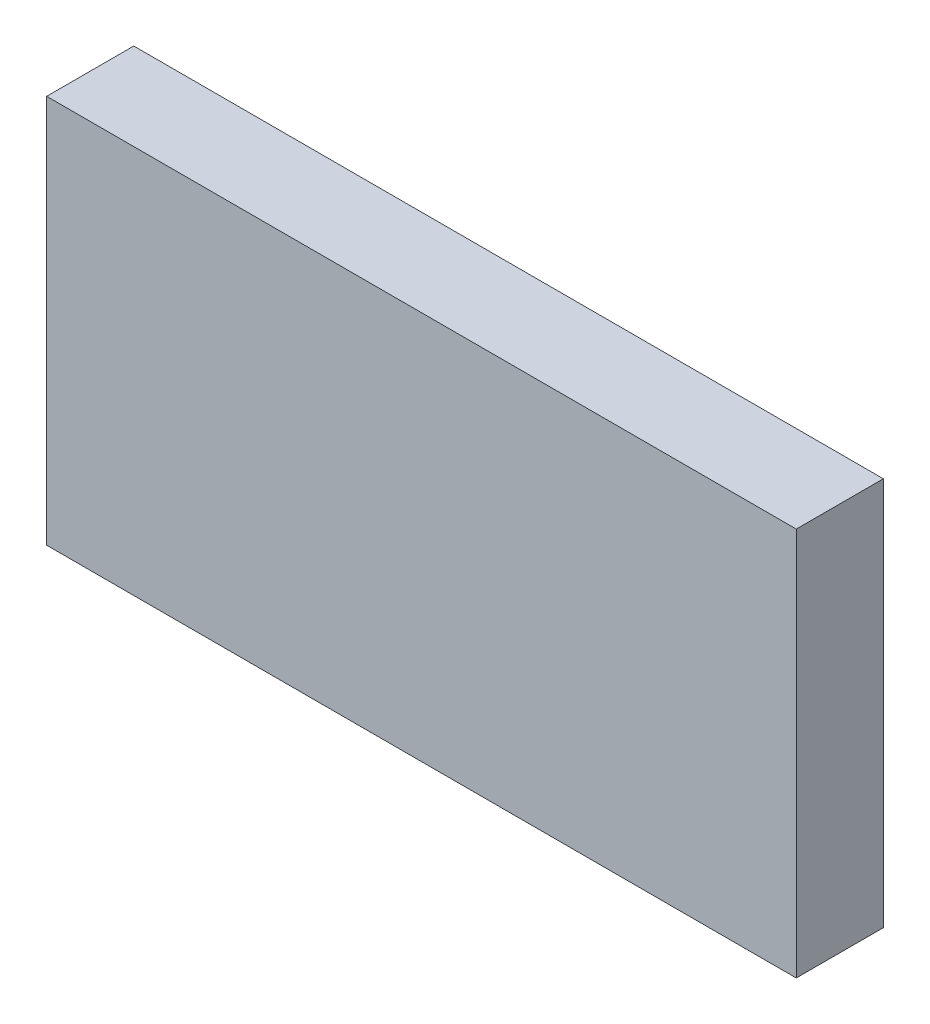
ISO-10303-21;
HEADER;
FILE_DESCRIPTION(('STEP AP214'),'2;1');
FILE_NAME('part.step','',(''),(''),'','','');
FILE_SCHEMA(('AUTOMOTIVE_DESIGN { 1 0 10303 214 1 1 1 1 }'));
ENDSEC;
DATA;
#1=APPLICATION_CONTEXT('core data for automotive mechanical design processes');
#2=APPLICATION_PROTOCOL_DEFINITION('international standard','automotive_design',2000,#1);
#3=PRODUCT_CONTEXT('',#1,'mechanical');
#4=PRODUCT('Part','Part','',(#3));
#5=PRODUCT_RELATED_PRODUCT_CATEGORY('part','',(#4));
#6=PRODUCT_DEFINITION_FORMATION('','',#4);
#7=PRODUCT_DEFINITION_CONTEXT('part definition',#1,'design');
#8=PRODUCT_DEFINITION('design','',#6,#7);
#9=PRODUCT_DEFINITION_SHAPE('','',#8);
#10=(LENGTH_UNIT() NAMED_UNIT(*) SI_UNIT(.MILLI.,.METRE.));
#11=(NAMED_UNIT(*) PLANE_ANGLE_UNIT() SI_UNIT($,.RADIAN.));
#12=(NAMED_UNIT(*) SI_UNIT($,.STERADIAN.) SOLID_ANGLE_UNIT());
#13=UNCERTAINTY_MEASURE_WITH_UNIT(LENGTH_MEASURE(1.E-05),#10,'distance_accuracy_value','');
#14=(GEOMETRIC_REPRESENTATION_CONTEXT(3) GLOBAL_UNCERTAINTY_ASSIGNED_CONTEXT((#13)) GLOBAL_UNIT_ASSIGNED_CONTEXT((#10,
#11,#12)) REPRESENTATION_CONTEXT('',''));
#15=CARTESIAN_POINT('',(0.,0.,0.));
#16=DIRECTION('',(0.,0.,1.));
#17=DIRECTION('',(1.,0.,0.));
#18=AXIS2_PLACEMENT_3D('',#15,#16,#17);
#19=CARTESIAN_POINT('',(0.,12.5,0.));
#20=DIRECTION('',(1.,0.,0.));
#21=DIRECTION('',(0.,0.,-1.));
#22=AXIS2_PLACEMENT_3D('',#19,#20,#21);
#23=PLANE('',#22);
#24=DIRECTION('',(0.,0.,1.));
#25=VECTOR('',#24,1.);
#26=CARTESIAN_POINT('',(0.,0.,0.));
#27=LINE('',#26,#25);
#28=CARTESIAN_POINT('',(0.,0.,-2.8));
#29=VERTEX_POINT('',#28);
#30=CARTESIAN_POINT('',(0.,0.,0.));
#31=VERTEX_POINT('',#30);
#32=EDGE_CURVE('E96',#29,#31,#27,.T.);
#33=ORIENTED_EDGE('',*,*,#32,.T.);
#34=DIRECTION('',(0.,-1.,0.));
#35=VECTOR('',#34,1.);
#36=CARTESIAN_POINT('',(0.,12.5,0.));
#37=LINE('',#36,#35);
#38=CARTESIAN_POINT('',(0.,12.5,0.));
#39=VERTEX_POINT('',#38);
#40=EDGE_CURVE('E11',#39,#31,#37,.T.);
#41=ORIENTED_EDGE('',*,*,#40,.F.);
#42=DIRECTION('',(0.,0.,1.));
#43=VECTOR('',#42,1.);
#44=CARTESIAN_POINT('',(0.,12.5,0.));
#45=LINE('',#44,#43);
#46=CARTESIAN_POINT('',(0.,12.5,-2.8));
#47=VERTEX_POINT('',#46);
#48=EDGE_CURVE('E84',#47,#39,#45,.T.);
#49=ORIENTED_EDGE('',*,*,#48,.F.);
#50=DIRECTION('',(0.,-1.,0.));
#51=VECTOR('',#50,1.);
#52=CARTESIAN_POINT('',(0.,12.5,-2.8));
#53=LINE('',#52,#51);
#54=EDGE_CURVE('E92',#47,#29,#53,.T.);
#55=ORIENTED_EDGE('',*,*,#54,.T.);
#56=EDGE_LOOP('',(#33,#41,#49,#55));
#57=FACE_BOUND('',#56,.T.);
#58=ADVANCED_FACE('F33',(#57),#23,.F.);
#59=CARTESIAN_POINT('',(0.,12.5,0.));
#60=DIRECTION('',(0.,0.,-1.));
#61=DIRECTION('',(-1.,0.,0.));
#62=AXIS2_PLACEMENT_3D('',#59,#60,#61);
#63=PLANE('',#62);
#64=DIRECTION('',(1.,0.,0.));
#65=VECTOR('',#64,1.);
#66=CARTESIAN_POINT('',(0.,0.,0.));
#67=LINE('',#66,#65);
#68=CARTESIAN_POINT('',(24.1,0.,0.));
#69=VERTEX_POINT('',#68);
#70=EDGE_CURVE('E88',#31,#69,#67,.T.);
#71=ORIENTED_EDGE('',*,*,#70,.T.);
#72=DIRECTION('',(0.,-1.,0.));
#73=VECTOR('',#72,1.);
#74=CARTESIAN_POINT('',(24.1,12.5,0.));
#75=LINE('',#74,#73);
#76=CARTESIAN_POINT('',(24.1,12.5,0.));
#77=VERTEX_POINT('',#76);
#78=EDGE_CURVE('E41',#77,#69,#75,.T.);
#79=ORIENTED_EDGE('',*,*,#78,.F.);
#80=DIRECTION('',(1.,0.,0.));
#81=VECTOR('',#80,1.);
#82=CARTESIAN_POINT('',(0.,12.5,0.));
#83=LINE('',#82,#81);
#84=EDGE_CURVE('E79',#39,#77,#83,.T.);
#85=ORIENTED_EDGE('',*,*,#84,.F.);
#86=ORIENTED_EDGE('',*,*,#40,.T.);
#87=EDGE_LOOP('',(#71,#79,#85,#86));
#88=FACE_BOUND('',#87,.T.);
#89=ADVANCED_FACE('F87',(#88),#63,.F.);
#90=CARTESIAN_POINT('',(24.1,12.5,0.));
#91=DIRECTION('',(-1.,0.,0.));
#92=DIRECTION('',(0.,0.,1.));
#93=AXIS2_PLACEMENT_3D('',#90,#91,#92);
#94=PLANE('',#93);
#95=DIRECTION('',(0.,0.,-1.));
#96=VECTOR('',#95,1.);
#97=CARTESIAN_POINT('',(24.1,0.,0.));
#98=LINE('',#97,#96);
#99=CARTESIAN_POINT('',(24.1,0.,-2.8));
#100=VERTEX_POINT('',#99);
#101=EDGE_CURVE('E66',#69,#100,#98,.T.);
#102=ORIENTED_EDGE('',*,*,#101,.T.);
#103=DIRECTION('',(0.,-1.,0.));
#104=VECTOR('',#103,1.);
#105=CARTESIAN_POINT('',(24.1,12.5,-2.8));
#106=LINE('',#105,#104);
#107=CARTESIAN_POINT('',(24.1,12.5,-2.8));
#108=VERTEX_POINT('',#107);
#109=EDGE_CURVE('E89',#108,#100,#106,.T.);
#110=ORIENTED_EDGE('',*,*,#109,.F.);
#111=DIRECTION('',(0.,0.,-1.));
#112=VECTOR('',#111,1.);
#113=CARTESIAN_POINT('',(24.1,12.5,0.));
#114=LINE('',#113,#112);
#115=EDGE_CURVE('E82',#77,#108,#114,.T.);
#116=ORIENTED_EDGE('',*,*,#115,.F.);
#117=ORIENTED_EDGE('',*,*,#78,.T.);
#118=EDGE_LOOP('',(#102,#110,#116,#117));
#119=FACE_BOUND('',#118,.T.);
#120=ADVANCED_FACE('F90',(#119),#94,.F.);
#121=CARTESIAN_POINT('',(0.,12.5,-2.8));
#122=DIRECTION('',(0.,0.,1.));
#123=DIRECTION('',(1.,0.,0.));
#124=AXIS2_PLACEMENT_3D('',#121,#122,#123);
#125=PLANE('',#124);
#126=DIRECTION('',(-1.,0.,0.));
#127=VECTOR('',#126,1.);
#128=CARTESIAN_POINT('',(0.,0.,-2.8));
#129=LINE('',#128,#127);
#130=EDGE_CURVE('E72',#100,#29,#129,.T.);
#131=ORIENTED_EDGE('',*,*,#130,.T.);
#132=ORIENTED_EDGE('',*,*,#54,.F.);
#133=DIRECTION('',(-1.,0.,0.));
#134=VECTOR('',#133,1.);
#135=CARTESIAN_POINT('',(0.,12.5,-2.8));
#136=LINE('',#135,#134);
#137=EDGE_CURVE('E49',#108,#47,#136,.T.);
#138=ORIENTED_EDGE('',*,*,#137,.F.);
#139=ORIENTED_EDGE('',*,*,#109,.T.);
#140=EDGE_LOOP('',(#131,#132,#138,#139));
#141=FACE_BOUND('',#140,.T.);
#142=ADVANCED_FACE('F103',(#141),#125,.F.);
#143=CARTESIAN_POINT('',(0.,12.5,0.));
#144=DIRECTION('',(0.,-1.,0.));
#145=DIRECTION('',(0.,0.,-1.));
#146=AXIS2_PLACEMENT_3D('',#143,#144,#145);
#147=PLANE('',#146);
#148=ORIENTED_EDGE('',*,*,#48,.T.);
#149=ORIENTED_EDGE('',*,*,#84,.T.);
#150=ORIENTED_EDGE('',*,*,#115,.T.);
#151=ORIENTED_EDGE('',*,*,#137,.T.);
#152=EDGE_LOOP('',(#148,#149,#150,#151));
#153=FACE_BOUND('',#152,.T.);
#154=ADVANCED_FACE('F80',(#153),#147,.F.);
#155=CARTESIAN_POINT('',(0.,0.,0.));
#156=DIRECTION('',(0.,-1.,0.));
#157=DIRECTION('',(0.,0.,-1.));
#158=AXIS2_PLACEMENT_3D('',#155,#156,#157);
#159=PLANE('',#158);
#160=ORIENTED_EDGE('',*,*,#32,.F.);
#161=ORIENTED_EDGE('',*,*,#130,.F.);
#162=ORIENTED_EDGE('',*,*,#101,.F.);
#163=ORIENTED_EDGE('',*,*,#70,.F.);
#164=EDGE_LOOP('',(#160,#161,#162,#163));
#165=FACE_BOUND('',#164,.T.);
#166=ADVANCED_FACE('F106',(#165),#159,.T.);
#167=CLOSED_SHELL('',(#58,#89,#120,#142,#154,#166));
#168=MANIFOLD_SOLID_BREP('B2',#167);
#169=ADVANCED_BREP_SHAPE_REPRESENTATION('',(#18,#168),#14);
#170=SHAPE_DEFINITION_REPRESENTATION(#9,#169);
ENDSEC;
END-ISO-10303-21;
